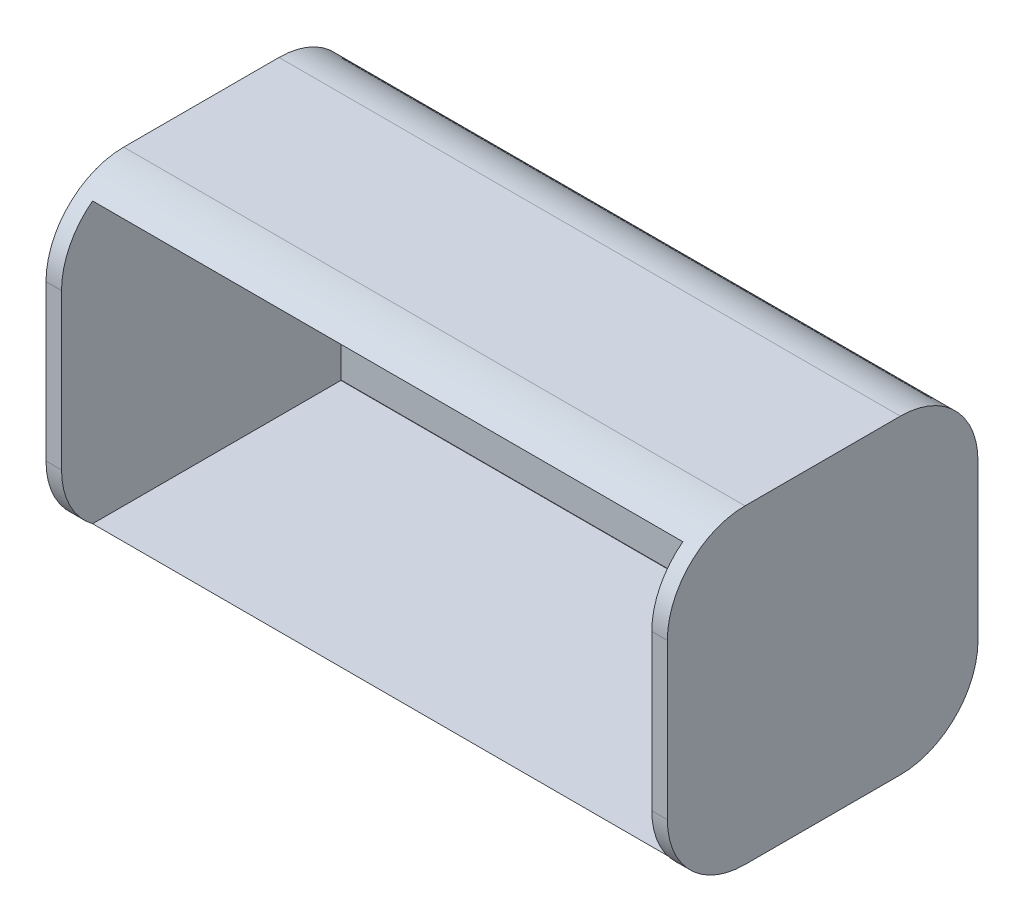
ISO-10303-21;
HEADER;
FILE_DESCRIPTION(('STEP AP214'),'2;1');
FILE_NAME('part.step','',(''),(''),'','','');
FILE_SCHEMA(('AUTOMOTIVE_DESIGN { 1 0 10303 214 1 1 1 1 }'));
ENDSEC;
DATA;
#1=APPLICATION_CONTEXT('core data for automotive mechanical design processes');
#2=APPLICATION_PROTOCOL_DEFINITION('international standard','automotive_design',2000,#1);
#3=PRODUCT_CONTEXT('',#1,'mechanical');
#4=PRODUCT('Part','Part','',(#3));
#5=PRODUCT_RELATED_PRODUCT_CATEGORY('part','',(#4));
#6=PRODUCT_DEFINITION_FORMATION('','',#4);
#7=PRODUCT_DEFINITION_CONTEXT('part definition',#1,'design');
#8=PRODUCT_DEFINITION('design','',#6,#7);
#9=PRODUCT_DEFINITION_SHAPE('','',#8);
#10=(LENGTH_UNIT() NAMED_UNIT(*) SI_UNIT(.MILLI.,.METRE.));
#11=(NAMED_UNIT(*) PLANE_ANGLE_UNIT() SI_UNIT($,.RADIAN.));
#12=(NAMED_UNIT(*) SI_UNIT($,.STERADIAN.) SOLID_ANGLE_UNIT());
#13=UNCERTAINTY_MEASURE_WITH_UNIT(LENGTH_MEASURE(1.E-05),#10,'distance_accuracy_value','');
#14=(GEOMETRIC_REPRESENTATION_CONTEXT(3) GLOBAL_UNCERTAINTY_ASSIGNED_CONTEXT((#13)) GLOBAL_UNIT_ASSIGNED_CONTEXT((#10,
#11,#12)) REPRESENTATION_CONTEXT('',''));
#15=CARTESIAN_POINT('',(0.,0.,0.));
#16=DIRECTION('',(0.,0.,1.));
#17=DIRECTION('',(1.,0.,0.));
#18=AXIS2_PLACEMENT_3D('',#15,#16,#17);
#19=CARTESIAN_POINT('',(0.,0.,100.));
#20=DIRECTION('',(0.,0.,-1.));
#21=DIRECTION('',(-1.,0.,0.));
#22=AXIS2_PLACEMENT_3D('',#19,#20,#21);
#23=PLANE('',#22);
#24=DIRECTION('',(0.,-1.,0.));
#25=VECTOR('',#24,1.);
#26=CARTESIAN_POINT('',(-100.,-50.,100.));
#27=LINE('',#26,#25);
#28=CARTESIAN_POINT('',(-100.,25.,100.));
#29=VERTEX_POINT('',#28);
#30=CARTESIAN_POINT('',(-100.,-25.,100.));
#31=VERTEX_POINT('',#30);
#32=EDGE_CURVE('E184',#29,#31,#27,.T.);
#33=ORIENTED_EDGE('',*,*,#32,.T.);
#34=DIRECTION('',(1.,0.,0.));
#35=VECTOR('',#34,1.);
#36=CARTESIAN_POINT('',(0.,-25.,100.));
#37=LINE('',#36,#35);
#38=CARTESIAN_POINT('',(-95.,-25.,100.));
#39=VERTEX_POINT('',#38);
#40=EDGE_CURVE('E210',#31,#39,#37,.T.);
#41=ORIENTED_EDGE('',*,*,#40,.T.);
#42=DIRECTION('',(0.,-1.,0.));
#43=VECTOR('',#42,1.);
#44=CARTESIAN_POINT('',(-95.,-45.,100.));
#45=LINE('',#44,#43);
#46=CARTESIAN_POINT('',(-95.,25.,100.));
#47=VERTEX_POINT('',#46);
#48=EDGE_CURVE('E163',#47,#39,#45,.T.);
#49=ORIENTED_EDGE('',*,*,#48,.F.);
#50=DIRECTION('',(-1.,0.,0.));
#51=VECTOR('',#50,1.);
#52=CARTESIAN_POINT('',(0.,25.,100.));
#53=LINE('',#52,#51);
#54=EDGE_CURVE('E203',#47,#29,#53,.T.);
#55=ORIENTED_EDGE('',*,*,#54,.T.);
#56=EDGE_LOOP('',(#33,#41,#49,#55));
#57=FACE_BOUND('',#56,.T.);
#58=ADVANCED_FACE('F34',(#57),#23,.F.);
#59=CARTESIAN_POINT('',(100.,-50.,100.));
#60=DIRECTION('',(-1.,0.,0.));
#61=DIRECTION('',(0.,0.,1.));
#62=AXIS2_PLACEMENT_3D('',#59,#60,#61);
#63=PLANE('',#62);
#64=DIRECTION('',(0.,1.,0.));
#65=VECTOR('',#64,1.);
#66=CARTESIAN_POINT('',(100.,-50.,100.));
#67=LINE('',#66,#65);
#68=CARTESIAN_POINT('',(100.,-25.,100.));
#69=VERTEX_POINT('',#68);
#70=CARTESIAN_POINT('',(100.,25.,100.));
#71=VERTEX_POINT('',#70);
#72=EDGE_CURVE('E181',#69,#71,#67,.T.);
#73=ORIENTED_EDGE('',*,*,#72,.F.);
#74=CARTESIAN_POINT('',(100.,-25.,75.));
#75=DIRECTION('',(-1.,0.,0.));
#76=DIRECTION('',(0.,0.,1.));
#77=AXIS2_PLACEMENT_3D('',#74,#75,#76);
#78=CIRCLE('',#77,25.);
#79=CARTESIAN_POINT('',(100.,-50.,75.));
#80=VERTEX_POINT('',#79);
#81=EDGE_CURVE('E228',#69,#80,#78,.F.);
#82=ORIENTED_EDGE('',*,*,#81,.T.);
#83=DIRECTION('',(0.,0.,-1.));
#84=VECTOR('',#83,1.);
#85=CARTESIAN_POINT('',(100.,-50.,100.));
#86=LINE('',#85,#84);
#87=CARTESIAN_POINT('',(100.,-50.,25.));
#88=VERTEX_POINT('',#87);
#89=EDGE_CURVE('E188',#80,#88,#86,.T.);
#90=ORIENTED_EDGE('',*,*,#89,.T.);
#91=CARTESIAN_POINT('',(100.,-25.,25.));
#92=DIRECTION('',(-1.,0.,0.));
#93=DIRECTION('',(0.,0.,1.));
#94=AXIS2_PLACEMENT_3D('',#91,#92,#93);
#95=CIRCLE('',#94,25.);
#96=CARTESIAN_POINT('',(100.,-25.,0.));
#97=VERTEX_POINT('',#96);
#98=EDGE_CURVE('E226',#88,#97,#95,.F.);
#99=ORIENTED_EDGE('',*,*,#98,.T.);
#100=DIRECTION('',(0.,1.,0.));
#101=VECTOR('',#100,1.);
#102=CARTESIAN_POINT('',(100.,-50.,0.));
#103=LINE('',#102,#101);
#104=CARTESIAN_POINT('',(100.,25.,0.));
#105=VERTEX_POINT('',#104);
#106=EDGE_CURVE('E176',#97,#105,#103,.T.);
#107=ORIENTED_EDGE('',*,*,#106,.T.);
#108=CARTESIAN_POINT('',(100.,25.,25.));
#109=DIRECTION('',(-1.,0.,0.));
#110=DIRECTION('',(0.,0.,1.));
#111=AXIS2_PLACEMENT_3D('',#108,#109,#110);
#112=CIRCLE('',#111,25.);
#113=CARTESIAN_POINT('',(100.,50.,25.));
#114=VERTEX_POINT('',#113);
#115=EDGE_CURVE('E222',#105,#114,#112,.F.);
#116=ORIENTED_EDGE('',*,*,#115,.T.);
#117=DIRECTION('',(0.,0.,-1.));
#118=VECTOR('',#117,1.);
#119=CARTESIAN_POINT('',(100.,50.,100.));
#120=LINE('',#119,#118);
#121=CARTESIAN_POINT('',(100.,50.,75.));
#122=VERTEX_POINT('',#121);
#123=EDGE_CURVE('E200',#122,#114,#120,.T.);
#124=ORIENTED_EDGE('',*,*,#123,.F.);
#125=CARTESIAN_POINT('',(100.,25.,75.));
#126=DIRECTION('',(-1.,0.,0.));
#127=DIRECTION('',(0.,0.,1.));
#128=AXIS2_PLACEMENT_3D('',#125,#126,#127);
#129=CIRCLE('',#128,25.);
#130=EDGE_CURVE('E224',#122,#71,#129,.F.);
#131=ORIENTED_EDGE('',*,*,#130,.T.);
#132=EDGE_LOOP('',(#73,#82,#90,#99,#107,#116,#124,#131));
#133=FACE_BOUND('',#132,.T.);
#134=ADVANCED_FACE('F256',(#133),#63,.F.);
#135=CARTESIAN_POINT('',(-100.,50.,100.));
#136=DIRECTION('',(0.,-1.,0.));
#137=DIRECTION('',(0.,0.,-1.));
#138=AXIS2_PLACEMENT_3D('',#135,#136,#137);
#139=PLANE('',#138);
#140=DIRECTION('',(0.,0.,-1.));
#141=VECTOR('',#140,1.);
#142=CARTESIAN_POINT('',(-100.,50.,100.));
#143=LINE('',#142,#141);
#144=CARTESIAN_POINT('',(-100.,50.,75.));
#145=VERTEX_POINT('',#144);
#146=CARTESIAN_POINT('',(-100.,50.,25.));
#147=VERTEX_POINT('',#146);
#148=EDGE_CURVE('E198',#145,#147,#143,.T.);
#149=ORIENTED_EDGE('',*,*,#148,.F.);
#150=DIRECTION('',(-1.,0.,0.));
#151=VECTOR('',#150,1.);
#152=CARTESIAN_POINT('',(-100.,50.,75.));
#153=LINE('',#152,#151);
#154=EDGE_CURVE('E42',#145,#122,#153,.F.);
#155=ORIENTED_EDGE('',*,*,#154,.T.);
#156=ORIENTED_EDGE('',*,*,#123,.T.);
#157=DIRECTION('',(-1.,0.,0.));
#158=VECTOR('',#157,1.);
#159=CARTESIAN_POINT('',(-100.,50.,25.));
#160=LINE('',#159,#158);
#161=EDGE_CURVE('E247',#114,#147,#160,.T.);
#162=ORIENTED_EDGE('',*,*,#161,.T.);
#163=EDGE_LOOP('',(#149,#155,#156,#162));
#164=FACE_BOUND('',#163,.T.);
#165=ADVANCED_FACE('F251',(#164),#139,.F.);
#166=CARTESIAN_POINT('',(-100.,-50.,100.));
#167=DIRECTION('',(1.,0.,0.));
#168=DIRECTION('',(0.,0.,-1.));
#169=AXIS2_PLACEMENT_3D('',#166,#167,#168);
#170=PLANE('',#169);
#171=CARTESIAN_POINT('',(-100.,0.,50.));
#172=DIRECTION('',(1.,0.,0.));
#173=DIRECTION('',(0.,0.,-1.));
#174=AXIS2_PLACEMENT_3D('',#171,#172,#173);
#175=CIRCLE('',#174,2.);
#176=CARTESIAN_POINT('',(-100.,0.,48.));
#177=VERTEX_POINT('',#176);
#178=EDGE_CURVE('E11',#177,#177,#175,.F.);
#179=ORIENTED_EDGE('',*,*,#178,.F.);
#180=EDGE_LOOP('',(#179));
#181=FACE_BOUND('',#180,.T.);
#182=DIRECTION('',(0.,0.,-1.));
#183=VECTOR('',#182,1.);
#184=CARTESIAN_POINT('',(-100.,-50.,100.));
#185=LINE('',#184,#183);
#186=CARTESIAN_POINT('',(-100.,-50.,75.));
#187=VERTEX_POINT('',#186);
#188=CARTESIAN_POINT('',(-100.,-50.,25.));
#189=VERTEX_POINT('',#188);
#190=EDGE_CURVE('E195',#187,#189,#185,.T.);
#191=ORIENTED_EDGE('',*,*,#190,.F.);
#192=CARTESIAN_POINT('',(-100.,-25.,75.));
#193=DIRECTION('',(1.,0.,0.));
#194=DIRECTION('',(0.,0.,-1.));
#195=AXIS2_PLACEMENT_3D('',#192,#193,#194);
#196=CIRCLE('',#195,25.);
#197=EDGE_CURVE('E239',#187,#31,#196,.F.);
#198=ORIENTED_EDGE('',*,*,#197,.T.);
#199=ORIENTED_EDGE('',*,*,#32,.F.);
#200=CARTESIAN_POINT('',(-100.,25.,75.));
#201=DIRECTION('',(1.,0.,0.));
#202=DIRECTION('',(0.,0.,-1.));
#203=AXIS2_PLACEMENT_3D('',#200,#201,#202);
#204=CIRCLE('',#203,25.);
#205=EDGE_CURVE('E57',#29,#145,#204,.F.);
#206=ORIENTED_EDGE('',*,*,#205,.T.);
#207=ORIENTED_EDGE('',*,*,#148,.T.);
#208=CARTESIAN_POINT('',(-100.,25.,25.));
#209=DIRECTION('',(1.,0.,0.));
#210=DIRECTION('',(0.,0.,-1.));
#211=AXIS2_PLACEMENT_3D('',#208,#209,#210);
#212=CIRCLE('',#211,25.);
#213=CARTESIAN_POINT('',(-100.,25.,0.));
#214=VERTEX_POINT('',#213);
#215=EDGE_CURVE('E49',#147,#214,#212,.F.);
#216=ORIENTED_EDGE('',*,*,#215,.T.);
#217=DIRECTION('',(0.,-1.,0.));
#218=VECTOR('',#217,1.);
#219=CARTESIAN_POINT('',(-100.,-50.,0.));
#220=LINE('',#219,#218);
#221=CARTESIAN_POINT('',(-100.,-25.,0.));
#222=VERTEX_POINT('',#221);
#223=EDGE_CURVE('E185',#214,#222,#220,.T.);
#224=ORIENTED_EDGE('',*,*,#223,.T.);
#225=CARTESIAN_POINT('',(-100.,-25.,25.));
#226=DIRECTION('',(1.,0.,0.));
#227=DIRECTION('',(0.,0.,-1.));
#228=AXIS2_PLACEMENT_3D('',#225,#226,#227);
#229=CIRCLE('',#228,25.);
#230=EDGE_CURVE('E237',#222,#189,#229,.F.);
#231=ORIENTED_EDGE('',*,*,#230,.T.);
#232=EDGE_LOOP('',(#191,#198,#199,#206,#207,#216,#224,#231));
#233=FACE_BOUND('',#232,.T.);
#234=ADVANCED_FACE('F277',(#181,#233),#170,.F.);
#235=CARTESIAN_POINT('',(-100.,-50.,100.));
#236=DIRECTION('',(0.,1.,0.));
#237=DIRECTION('',(0.,0.,1.));
#238=AXIS2_PLACEMENT_3D('',#235,#236,#237);
#239=PLANE('',#238);
#240=ORIENTED_EDGE('',*,*,#89,.F.);
#241=DIRECTION('',(1.,0.,0.));
#242=VECTOR('',#241,1.);
#243=CARTESIAN_POINT('',(-100.,-50.,75.));
#244=LINE('',#243,#242);
#245=EDGE_CURVE('E233',#80,#187,#244,.F.);
#246=ORIENTED_EDGE('',*,*,#245,.T.);
#247=ORIENTED_EDGE('',*,*,#190,.T.);
#248=DIRECTION('',(1.,0.,0.));
#249=VECTOR('',#248,1.);
#250=CARTESIAN_POINT('',(100.,-50.,25.));
#251=LINE('',#250,#249);
#252=EDGE_CURVE('E230',#189,#88,#251,.T.);
#253=ORIENTED_EDGE('',*,*,#252,.T.);
#254=EDGE_LOOP('',(#240,#246,#247,#253));
#255=FACE_BOUND('',#254,.T.);
#256=ADVANCED_FACE('F273',(#255),#239,.F.);
#257=DIRECTION('',(0.,1.,0.));
#258=VECTOR('',#257,1.);
#259=CARTESIAN_POINT('',(95.,-45.,100.));
#260=LINE('',#259,#258);
#261=CARTESIAN_POINT('',(95.,-25.,100.));
#262=VERTEX_POINT('',#261);
#263=CARTESIAN_POINT('',(95.,25.,100.));
#264=VERTEX_POINT('',#263);
#265=EDGE_CURVE('E166',#262,#264,#260,.T.);
#266=ORIENTED_EDGE('',*,*,#265,.F.);
#267=DIRECTION('',(1.,0.,0.));
#268=VECTOR('',#267,1.);
#269=CARTESIAN_POINT('',(0.,-25.,100.));
#270=LINE('',#269,#268);
#271=EDGE_CURVE('E208',#262,#69,#270,.T.);
#272=ORIENTED_EDGE('',*,*,#271,.T.);
#273=ORIENTED_EDGE('',*,*,#72,.T.);
#274=DIRECTION('',(-1.,0.,0.));
#275=VECTOR('',#274,1.);
#276=CARTESIAN_POINT('',(0.,25.,100.));
#277=LINE('',#276,#275);
#278=EDGE_CURVE('E205',#71,#264,#277,.T.);
#279=ORIENTED_EDGE('',*,*,#278,.T.);
#280=EDGE_LOOP('',(#266,#272,#273,#279));
#281=FACE_BOUND('',#280,.T.);
#282=ADVANCED_FACE('F262',(#281),#23,.F.);
#283=CARTESIAN_POINT('',(0.,0.,0.));
#284=DIRECTION('',(0.,0.,-1.));
#285=DIRECTION('',(-1.,0.,0.));
#286=AXIS2_PLACEMENT_3D('',#283,#284,#285);
#287=PLANE('',#286);
#288=ORIENTED_EDGE('',*,*,#106,.F.);
#289=DIRECTION('',(1.,0.,0.));
#290=VECTOR('',#289,1.);
#291=CARTESIAN_POINT('',(-100.,-25.,0.));
#292=LINE('',#291,#290);
#293=EDGE_CURVE('E243',#97,#222,#292,.F.);
#294=ORIENTED_EDGE('',*,*,#293,.T.);
#295=ORIENTED_EDGE('',*,*,#223,.F.);
#296=DIRECTION('',(-1.,0.,0.));
#297=VECTOR('',#296,1.);
#298=CARTESIAN_POINT('',(100.,25.,0.));
#299=LINE('',#298,#297);
#300=EDGE_CURVE('E241',#214,#105,#299,.F.);
#301=ORIENTED_EDGE('',*,*,#300,.T.);
#302=EDGE_LOOP('',(#288,#294,#295,#301));
#303=FACE_BOUND('',#302,.T.);
#304=ADVANCED_FACE('F293',(#303),#287,.T.);
#305=CARTESIAN_POINT('',(95.,-45.,10.));
#306=DIRECTION('',(1.,0.,0.));
#307=DIRECTION('',(0.,0.,-1.));
#308=AXIS2_PLACEMENT_3D('',#305,#306,#307);
#309=PLANE('',#308);
#310=DIRECTION('',(0.,0.,1.));
#311=VECTOR('',#310,1.);
#312=CARTESIAN_POINT('',(95.,-45.,10.));
#313=LINE('',#312,#311);
#314=CARTESIAN_POINT('',(95.,-45.,10.));
#315=VERTEX_POINT('',#314);
#316=CARTESIAN_POINT('',(95.,-45.,90.));
#317=VERTEX_POINT('',#316);
#318=EDGE_CURVE('E174',#315,#317,#313,.T.);
#319=ORIENTED_EDGE('',*,*,#318,.T.);
#320=CARTESIAN_POINT('',(95.,-25.,75.));
#321=DIRECTION('',(1.,0.,0.));
#322=DIRECTION('',(0.,0.,-1.));
#323=AXIS2_PLACEMENT_3D('',#320,#321,#322);
#324=CIRCLE('',#323,25.);
#325=EDGE_CURVE('E220',#317,#262,#324,.F.);
#326=ORIENTED_EDGE('',*,*,#325,.T.);
#327=ORIENTED_EDGE('',*,*,#265,.T.);
#328=CARTESIAN_POINT('',(95.,25.,75.));
#329=DIRECTION('',(1.,0.,0.));
#330=DIRECTION('',(0.,0.,-1.));
#331=AXIS2_PLACEMENT_3D('',#328,#329,#330);
#332=CIRCLE('',#331,25.);
#333=CARTESIAN_POINT('',(95.,45.,90.));
#334=VERTEX_POINT('',#333);
#335=EDGE_CURVE('E146',#264,#334,#332,.F.);
#336=ORIENTED_EDGE('',*,*,#335,.T.);
#337=DIRECTION('',(0.,0.,1.));
#338=VECTOR('',#337,1.);
#339=CARTESIAN_POINT('',(95.,45.,10.));
#340=LINE('',#339,#338);
#341=CARTESIAN_POINT('',(95.,45.,10.));
#342=VERTEX_POINT('',#341);
#343=EDGE_CURVE('E138',#342,#334,#340,.T.);
#344=ORIENTED_EDGE('',*,*,#343,.F.);
#345=DIRECTION('',(0.,1.,0.));
#346=VECTOR('',#345,1.);
#347=CARTESIAN_POINT('',(95.,-45.,10.));
#348=LINE('',#347,#346);
#349=EDGE_CURVE('E143',#315,#342,#348,.T.);
#350=ORIENTED_EDGE('',*,*,#349,.F.);
#351=EDGE_LOOP('',(#319,#326,#327,#336,#344,#350));
#352=FACE_BOUND('',#351,.T.);
#353=ADVANCED_FACE('F141',(#352),#309,.F.);
#354=CARTESIAN_POINT('',(-95.,-45.,10.));
#355=DIRECTION('',(0.,-1.,0.));
#356=DIRECTION('',(0.,0.,-1.));
#357=AXIS2_PLACEMENT_3D('',#354,#355,#356);
#358=PLANE('',#357);
#359=DIRECTION('',(0.,0.,1.));
#360=VECTOR('',#359,1.);
#361=CARTESIAN_POINT('',(-95.,-45.,10.));
#362=LINE('',#361,#360);
#363=CARTESIAN_POINT('',(-95.,-45.,10.));
#364=VERTEX_POINT('',#363);
#365=CARTESIAN_POINT('',(-95.,-45.,90.));
#366=VERTEX_POINT('',#365);
#367=EDGE_CURVE('E177',#364,#366,#362,.T.);
#368=ORIENTED_EDGE('',*,*,#367,.T.);
#369=DIRECTION('',(1.,0.,0.));
#370=VECTOR('',#369,1.);
#371=CARTESIAN_POINT('',(-95.,-45.,90.));
#372=LINE('',#371,#370);
#373=EDGE_CURVE('E217',#366,#317,#372,.T.);
#374=ORIENTED_EDGE('',*,*,#373,.T.);
#375=ORIENTED_EDGE('',*,*,#318,.F.);
#376=DIRECTION('',(1.,0.,0.));
#377=VECTOR('',#376,1.);
#378=CARTESIAN_POINT('',(-95.,-45.,10.));
#379=LINE('',#378,#377);
#380=EDGE_CURVE('E150',#364,#315,#379,.T.);
#381=ORIENTED_EDGE('',*,*,#380,.F.);
#382=EDGE_LOOP('',(#368,#374,#375,#381));
#383=FACE_BOUND('',#382,.T.);
#384=ADVANCED_FACE('F285',(#383),#358,.F.);
#385=CARTESIAN_POINT('',(-95.,-45.,10.));
#386=DIRECTION('',(-1.,0.,0.));
#387=DIRECTION('',(0.,0.,1.));
#388=AXIS2_PLACEMENT_3D('',#385,#386,#387);
#389=PLANE('',#388);
#390=ORIENTED_EDGE('',*,*,#48,.T.);
#391=CARTESIAN_POINT('',(-95.,-25.,75.));
#392=DIRECTION('',(-1.,0.,0.));
#393=DIRECTION('',(0.,0.,1.));
#394=AXIS2_PLACEMENT_3D('',#391,#392,#393);
#395=CIRCLE('',#394,25.);
#396=EDGE_CURVE('E215',#39,#366,#395,.F.);
#397=ORIENTED_EDGE('',*,*,#396,.T.);
#398=ORIENTED_EDGE('',*,*,#367,.F.);
#399=DIRECTION('',(0.,-1.,0.));
#400=VECTOR('',#399,1.);
#401=CARTESIAN_POINT('',(-95.,-45.,10.));
#402=LINE('',#401,#400);
#403=CARTESIAN_POINT('',(-95.,45.,10.));
#404=VERTEX_POINT('',#403);
#405=EDGE_CURVE('E159',#404,#364,#402,.T.);
#406=ORIENTED_EDGE('',*,*,#405,.F.);
#407=DIRECTION('',(0.,0.,1.));
#408=VECTOR('',#407,1.);
#409=CARTESIAN_POINT('',(-95.,45.,10.));
#410=LINE('',#409,#408);
#411=CARTESIAN_POINT('',(-95.,45.,90.));
#412=VERTEX_POINT('',#411);
#413=EDGE_CURVE('E149',#404,#412,#410,.T.);
#414=ORIENTED_EDGE('',*,*,#413,.T.);
#415=CARTESIAN_POINT('',(-95.,25.,75.));
#416=DIRECTION('',(-1.,0.,0.));
#417=DIRECTION('',(0.,0.,1.));
#418=AXIS2_PLACEMENT_3D('',#415,#416,#417);
#419=CIRCLE('',#418,25.);
#420=EDGE_CURVE('E213',#412,#47,#419,.F.);
#421=ORIENTED_EDGE('',*,*,#420,.T.);
#422=EDGE_LOOP('',(#390,#397,#398,#406,#414,#421));
#423=FACE_BOUND('',#422,.T.);
#424=ADVANCED_FACE('F283',(#423),#389,.F.);
#425=CARTESIAN_POINT('',(-95.,45.,10.));
#426=DIRECTION('',(0.,1.,0.));
#427=DIRECTION('',(0.,0.,1.));
#428=AXIS2_PLACEMENT_3D('',#425,#426,#427);
#429=PLANE('',#428);
#430=ORIENTED_EDGE('',*,*,#343,.T.);
#431=DIRECTION('',(-1.,0.,0.));
#432=VECTOR('',#431,1.);
#433=CARTESIAN_POINT('',(95.,45.,90.));
#434=LINE('',#433,#432);
#435=EDGE_CURVE('E245',#334,#412,#434,.T.);
#436=ORIENTED_EDGE('',*,*,#435,.T.);
#437=ORIENTED_EDGE('',*,*,#413,.F.);
#438=DIRECTION('',(-1.,0.,0.));
#439=VECTOR('',#438,1.);
#440=CARTESIAN_POINT('',(-95.,45.,10.));
#441=LINE('',#440,#439);
#442=EDGE_CURVE('E153',#342,#404,#441,.T.);
#443=ORIENTED_EDGE('',*,*,#442,.F.);
#444=EDGE_LOOP('',(#430,#436,#437,#443));
#445=FACE_BOUND('',#444,.T.);
#446=ADVANCED_FACE('F154',(#445),#429,.F.);
#447=CARTESIAN_POINT('',(0.,0.,10.));
#448=DIRECTION('',(0.,0.,-1.));
#449=DIRECTION('',(-1.,0.,0.));
#450=AXIS2_PLACEMENT_3D('',#447,#448,#449);
#451=PLANE('',#450);
#452=ORIENTED_EDGE('',*,*,#349,.T.);
#453=ORIENTED_EDGE('',*,*,#442,.T.);
#454=ORIENTED_EDGE('',*,*,#405,.T.);
#455=ORIENTED_EDGE('',*,*,#380,.T.);
#456=EDGE_LOOP('',(#452,#453,#454,#455));
#457=FACE_BOUND('',#456,.T.);
#458=ADVANCED_FACE('F161',(#457),#451,.F.);
#459=CARTESIAN_POINT('',(0.,-25.,75.));
#460=DIRECTION('',(1.,0.,0.));
#461=DIRECTION('',(0.,0.,-1.));
#462=AXIS2_PLACEMENT_3D('',#459,#460,#461);
#463=CYLINDRICAL_SURFACE('',#462,25.);
#464=ORIENTED_EDGE('',*,*,#197,.F.);
#465=ORIENTED_EDGE('',*,*,#245,.F.);
#466=ORIENTED_EDGE('',*,*,#81,.F.);
#467=ORIENTED_EDGE('',*,*,#271,.F.);
#468=ORIENTED_EDGE('',*,*,#325,.F.);
#469=ORIENTED_EDGE('',*,*,#373,.F.);
#470=ORIENTED_EDGE('',*,*,#396,.F.);
#471=ORIENTED_EDGE('',*,*,#40,.F.);
#472=EDGE_LOOP('',(#464,#465,#466,#467,#468,#469,#470,#471));
#473=FACE_BOUND('',#472,.T.);
#474=ADVANCED_FACE('F268',(#473),#463,.T.);
#475=CARTESIAN_POINT('',(-100.,-25.,25.));
#476=DIRECTION('',(-1.,0.,0.));
#477=DIRECTION('',(0.,0.,1.));
#478=AXIS2_PLACEMENT_3D('',#475,#476,#477);
#479=CYLINDRICAL_SURFACE('',#478,25.);
#480=ORIENTED_EDGE('',*,*,#230,.F.);
#481=ORIENTED_EDGE('',*,*,#293,.F.);
#482=ORIENTED_EDGE('',*,*,#98,.F.);
#483=ORIENTED_EDGE('',*,*,#252,.F.);
#484=EDGE_LOOP('',(#480,#481,#482,#483));
#485=FACE_BOUND('',#484,.T.);
#486=ADVANCED_FACE('F320',(#485),#479,.T.);
#487=CARTESIAN_POINT('',(0.,25.,75.));
#488=DIRECTION('',(-1.,0.,0.));
#489=DIRECTION('',(0.,0.,1.));
#490=AXIS2_PLACEMENT_3D('',#487,#488,#489);
#491=CYLINDRICAL_SURFACE('',#490,25.);
#492=ORIENTED_EDGE('',*,*,#130,.F.);
#493=ORIENTED_EDGE('',*,*,#154,.F.);
#494=ORIENTED_EDGE('',*,*,#205,.F.);
#495=ORIENTED_EDGE('',*,*,#54,.F.);
#496=ORIENTED_EDGE('',*,*,#420,.F.);
#497=ORIENTED_EDGE('',*,*,#435,.F.);
#498=ORIENTED_EDGE('',*,*,#335,.F.);
#499=ORIENTED_EDGE('',*,*,#278,.F.);
#500=EDGE_LOOP('',(#492,#493,#494,#495,#496,#497,#498,#499));
#501=FACE_BOUND('',#500,.T.);
#502=ADVANCED_FACE('F259',(#501),#491,.T.);
#503=CARTESIAN_POINT('',(-100.,25.,25.));
#504=DIRECTION('',(1.,0.,0.));
#505=DIRECTION('',(0.,0.,-1.));
#506=AXIS2_PLACEMENT_3D('',#503,#504,#505);
#507=CYLINDRICAL_SURFACE('',#506,25.);
#508=ORIENTED_EDGE('',*,*,#115,.F.);
#509=ORIENTED_EDGE('',*,*,#300,.F.);
#510=ORIENTED_EDGE('',*,*,#215,.F.);
#511=ORIENTED_EDGE('',*,*,#161,.F.);
#512=EDGE_LOOP('',(#508,#509,#510,#511));
#513=FACE_BOUND('',#512,.T.);
#514=ADVANCED_FACE('F36',(#513),#507,.T.);
#515=CARTESIAN_POINT('',(-110.,0.,50.));
#516=DIRECTION('',(1.,0.,0.));
#517=DIRECTION('',(0.,0.,-1.));
#518=AXIS2_PLACEMENT_3D('',#515,#516,#517);
#519=CYLINDRICAL_SURFACE('',#518,2.);
#520=CARTESIAN_POINT('',(-110.,0.,50.));
#521=DIRECTION('',(-1.,0.,0.));
#522=DIRECTION('',(0.,0.,1.));
#523=AXIS2_PLACEMENT_3D('',#520,#521,#522);
#524=CIRCLE('',#523,2.);
#525=CARTESIAN_POINT('',(-110.,0.,52.));
#526=VERTEX_POINT('',#525);
#527=EDGE_CURVE('E169',#526,#526,#524,.T.);
#528=ORIENTED_EDGE('',*,*,#527,.F.);
#529=EDGE_LOOP('',(#528));
#530=FACE_BOUND('',#529,.T.);
#531=ORIENTED_EDGE('',*,*,#178,.T.);
#532=EDGE_LOOP('',(#531));
#533=FACE_BOUND('',#532,.T.);
#534=ADVANCED_FACE('F327',(#530,#533),#519,.T.);
#535=CARTESIAN_POINT('',(-110.,0.,50.));
#536=DIRECTION('',(-1.,0.,0.));
#537=DIRECTION('',(0.,0.,1.));
#538=AXIS2_PLACEMENT_3D('',#535,#536,#537);
#539=PLANE('',#538);
#540=ORIENTED_EDGE('',*,*,#527,.T.);
#541=EDGE_LOOP('',(#540));
#542=FACE_BOUND('',#541,.T.);
#543=ADVANCED_FACE('F331',(#542),#539,.T.);
#544=CLOSED_SHELL('',(#58,#134,#165,#234,#256,#282,#304,#353,#384,#424,#446,#458,#474,#486,#502,
#514,#534,#543));
#545=MANIFOLD_SOLID_BREP('B2',#544);
#546=ADVANCED_BREP_SHAPE_REPRESENTATION('',(#18,#545),#14);
#547=SHAPE_DEFINITION_REPRESENTATION(#9,#546);
ENDSEC;
END-ISO-10303-21;
